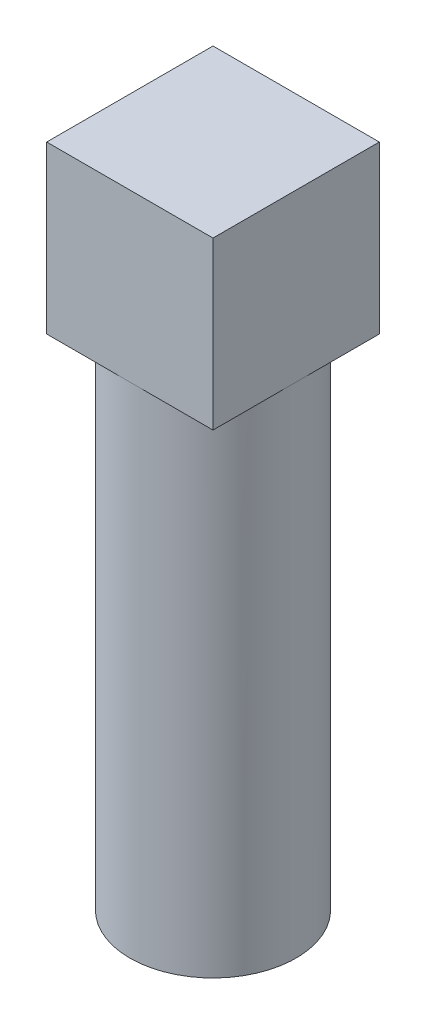
ISO-10303-21;
HEADER;
FILE_DESCRIPTION(('STEP AP214'),'2;1');
FILE_NAME('part.step','',(''),(''),'','','');
FILE_SCHEMA(('AUTOMOTIVE_DESIGN { 1 0 10303 214 1 1 1 1 }'));
ENDSEC;
DATA;
#1=APPLICATION_CONTEXT('core data for automotive mechanical design processes');
#2=APPLICATION_PROTOCOL_DEFINITION('international standard','automotive_design',2000,#1);
#3=PRODUCT_CONTEXT('',#1,'mechanical');
#4=PRODUCT('Part','Part','',(#3));
#5=PRODUCT_RELATED_PRODUCT_CATEGORY('part','',(#4));
#6=PRODUCT_DEFINITION_FORMATION('','',#4);
#7=PRODUCT_DEFINITION_CONTEXT('part definition',#1,'design');
#8=PRODUCT_DEFINITION('design','',#6,#7);
#9=PRODUCT_DEFINITION_SHAPE('','',#8);
#10=(LENGTH_UNIT() NAMED_UNIT(*) SI_UNIT(.MILLI.,.METRE.));
#11=(NAMED_UNIT(*) PLANE_ANGLE_UNIT() SI_UNIT($,.RADIAN.));
#12=(NAMED_UNIT(*) SI_UNIT($,.STERADIAN.) SOLID_ANGLE_UNIT());
#13=UNCERTAINTY_MEASURE_WITH_UNIT(LENGTH_MEASURE(1.E-05),#10,'distance_accuracy_value','');
#14=(GEOMETRIC_REPRESENTATION_CONTEXT(3) GLOBAL_UNCERTAINTY_ASSIGNED_CONTEXT((#13)) GLOBAL_UNIT_ASSIGNED_CONTEXT((#10,
#11,#12)) REPRESENTATION_CONTEXT('',''));
#15=CARTESIAN_POINT('',(0.,0.,0.));
#16=DIRECTION('',(0.,0.,1.));
#17=DIRECTION('',(1.,0.,0.));
#18=AXIS2_PLACEMENT_3D('',#15,#16,#17);
#19=CARTESIAN_POINT('',(0.,4.,0.));
#20=DIRECTION('',(0.,-1.,0.));
#21=DIRECTION('',(0.,0.,-1.));
#22=AXIS2_PLACEMENT_3D('',#19,#20,#21);
#23=CYLINDRICAL_SURFACE('',#22,0.5);
#24=CARTESIAN_POINT('',(0.,3.,0.));
#25=DIRECTION('',(0.,-1.,0.));
#26=DIRECTION('',(0.,0.,-1.));
#27=AXIS2_PLACEMENT_3D('',#24,#25,#26);
#28=CIRCLE('',#27,0.5);
#29=CARTESIAN_POINT('',(-0.5,3.,0.));
#30=VERTEX_POINT('',#29);
#31=CARTESIAN_POINT('',(0.,3.,-0.5));
#32=VERTEX_POINT('',#31);
#33=EDGE_CURVE('E38',#30,#32,#28,.T.);
#34=ORIENTED_EDGE('',*,*,#33,.T.);
#35=CARTESIAN_POINT('',(0.5,3.,0.));
#36=VERTEX_POINT('',#35);
#37=EDGE_CURVE('E11',#32,#36,#28,.T.);
#38=ORIENTED_EDGE('',*,*,#37,.T.);
#39=CARTESIAN_POINT('',(0.,3.,0.5));
#40=VERTEX_POINT('',#39);
#41=EDGE_CURVE('E43',#36,#40,#28,.T.);
#42=ORIENTED_EDGE('',*,*,#41,.T.);
#43=EDGE_CURVE('E113',#40,#30,#28,.T.);
#44=ORIENTED_EDGE('',*,*,#43,.T.);
#45=EDGE_LOOP('',(#34,#38,#42,#44));
#46=FACE_BOUND('',#45,.T.);
#47=CARTESIAN_POINT('',(0.,0.,0.));
#48=DIRECTION('',(0.,1.,0.));
#49=DIRECTION('',(0.,0.,1.));
#50=AXIS2_PLACEMENT_3D('',#47,#48,#49);
#51=CIRCLE('',#50,0.5);
#52=CARTESIAN_POINT('',(0.,0.,0.5));
#53=VERTEX_POINT('',#52);
#54=EDGE_CURVE('E133',#53,#53,#51,.T.);
#55=ORIENTED_EDGE('',*,*,#54,.T.);
#56=EDGE_LOOP('',(#55));
#57=FACE_BOUND('',#56,.T.);
#58=ADVANCED_FACE('F35',(#46,#57),#23,.T.);
#59=CARTESIAN_POINT('',(0.,0.,0.));
#60=DIRECTION('',(0.,1.,0.));
#61=DIRECTION('',(0.,0.,1.));
#62=AXIS2_PLACEMENT_3D('',#59,#60,#61);
#63=PLANE('',#62);
#64=ORIENTED_EDGE('',*,*,#54,.F.);
#65=EDGE_LOOP('',(#64));
#66=FACE_BOUND('',#65,.T.);
#67=ADVANCED_FACE('F165',(#66),#63,.F.);
#68=CARTESIAN_POINT('',(0.,3.,0.));
#69=DIRECTION('',(0.,-1.,0.));
#70=DIRECTION('',(0.,0.,-1.));
#71=AXIS2_PLACEMENT_3D('',#68,#69,#70);
#72=PLANE('',#71);
#73=ORIENTED_EDGE('',*,*,#37,.F.);
#74=DIRECTION('',(-1.,0.,0.));
#75=VECTOR('',#74,1.);
#76=CARTESIAN_POINT('',(0.5,3.,-0.5));
#77=LINE('',#76,#75);
#78=CARTESIAN_POINT('',(0.5,3.,-0.5));
#79=VERTEX_POINT('',#78);
#80=EDGE_CURVE('E50',#79,#32,#77,.T.);
#81=ORIENTED_EDGE('',*,*,#80,.F.);
#82=DIRECTION('',(0.,0.,-1.));
#83=VECTOR('',#82,1.);
#84=CARTESIAN_POINT('',(0.5,3.,-0.5));
#85=LINE('',#84,#83);
#86=EDGE_CURVE('E115',#36,#79,#85,.T.);
#87=ORIENTED_EDGE('',*,*,#86,.F.);
#88=EDGE_LOOP('',(#73,#81,#87));
#89=FACE_BOUND('',#88,.T.);
#90=ADVANCED_FACE('F147',(#89),#72,.T.);
#91=ORIENTED_EDGE('',*,*,#41,.F.);
#92=CARTESIAN_POINT('',(0.5,3.,0.5));
#93=VERTEX_POINT('',#92);
#94=EDGE_CURVE('E118',#93,#36,#85,.T.);
#95=ORIENTED_EDGE('',*,*,#94,.F.);
#96=DIRECTION('',(1.,0.,0.));
#97=VECTOR('',#96,1.);
#98=CARTESIAN_POINT('',(0.5,3.,0.5));
#99=LINE('',#98,#97);
#100=EDGE_CURVE('E116',#40,#93,#99,.T.);
#101=ORIENTED_EDGE('',*,*,#100,.F.);
#102=EDGE_LOOP('',(#91,#95,#101));
#103=FACE_BOUND('',#102,.T.);
#104=ADVANCED_FACE('F145',(#103),#72,.T.);
#105=ORIENTED_EDGE('',*,*,#43,.F.);
#106=CARTESIAN_POINT('',(-0.5,3.,0.5));
#107=VERTEX_POINT('',#106);
#108=EDGE_CURVE('E104',#107,#40,#99,.T.);
#109=ORIENTED_EDGE('',*,*,#108,.F.);
#110=DIRECTION('',(0.,0.,1.));
#111=VECTOR('',#110,1.);
#112=CARTESIAN_POINT('',(-0.5,3.,-0.5));
#113=LINE('',#112,#111);
#114=EDGE_CURVE('E89',#30,#107,#113,.T.);
#115=ORIENTED_EDGE('',*,*,#114,.F.);
#116=EDGE_LOOP('',(#105,#109,#115));
#117=FACE_BOUND('',#116,.T.);
#118=ADVANCED_FACE('F112',(#117),#72,.T.);
#119=ORIENTED_EDGE('',*,*,#33,.F.);
#120=CARTESIAN_POINT('',(-0.5,3.,-0.5));
#121=VERTEX_POINT('',#120);
#122=EDGE_CURVE('E95',#121,#30,#113,.T.);
#123=ORIENTED_EDGE('',*,*,#122,.F.);
#124=EDGE_CURVE('E122',#32,#121,#77,.T.);
#125=ORIENTED_EDGE('',*,*,#124,.F.);
#126=EDGE_LOOP('',(#119,#123,#125));
#127=FACE_BOUND('',#126,.T.);
#128=ADVANCED_FACE('F155',(#127),#72,.T.);
#129=CARTESIAN_POINT('',(-0.5,3.,-0.5));
#130=DIRECTION('',(-1.,0.,0.));
#131=DIRECTION('',(0.,0.,1.));
#132=AXIS2_PLACEMENT_3D('',#129,#130,#131);
#133=PLANE('',#132);
#134=ORIENTED_EDGE('',*,*,#122,.T.);
#135=ORIENTED_EDGE('',*,*,#114,.T.);
#136=DIRECTION('',(0.,1.,0.));
#137=VECTOR('',#136,1.);
#138=CARTESIAN_POINT('',(-0.5,3.,0.5));
#139=LINE('',#138,#137);
#140=CARTESIAN_POINT('',(-0.5,4.,0.5));
#141=VERTEX_POINT('',#140);
#142=EDGE_CURVE('E93',#107,#141,#139,.T.);
#143=ORIENTED_EDGE('',*,*,#142,.T.);
#144=DIRECTION('',(0.,0.,1.));
#145=VECTOR('',#144,1.);
#146=CARTESIAN_POINT('',(-0.5,4.,-0.5));
#147=LINE('',#146,#145);
#148=CARTESIAN_POINT('',(-0.5,4.,-0.5));
#149=VERTEX_POINT('',#148);
#150=EDGE_CURVE('E124',#149,#141,#147,.T.);
#151=ORIENTED_EDGE('',*,*,#150,.F.);
#152=DIRECTION('',(0.,1.,0.));
#153=VECTOR('',#152,1.);
#154=CARTESIAN_POINT('',(-0.5,3.,-0.5));
#155=LINE('',#154,#153);
#156=EDGE_CURVE('E130',#121,#149,#155,.T.);
#157=ORIENTED_EDGE('',*,*,#156,.F.);
#158=EDGE_LOOP('',(#134,#135,#143,#151,#157));
#159=FACE_BOUND('',#158,.T.);
#160=ADVANCED_FACE('F91',(#159),#133,.T.);
#161=CARTESIAN_POINT('',(0.5,3.,-0.5));
#162=DIRECTION('',(0.,0.,-1.));
#163=DIRECTION('',(-1.,0.,0.));
#164=AXIS2_PLACEMENT_3D('',#161,#162,#163);
#165=PLANE('',#164);
#166=ORIENTED_EDGE('',*,*,#80,.T.);
#167=ORIENTED_EDGE('',*,*,#124,.T.);
#168=ORIENTED_EDGE('',*,*,#156,.T.);
#169=DIRECTION('',(-1.,0.,0.));
#170=VECTOR('',#169,1.);
#171=CARTESIAN_POINT('',(0.5,4.,-0.5));
#172=LINE('',#171,#170);
#173=CARTESIAN_POINT('',(0.5,4.,-0.5));
#174=VERTEX_POINT('',#173);
#175=EDGE_CURVE('E99',#174,#149,#172,.T.);
#176=ORIENTED_EDGE('',*,*,#175,.F.);
#177=DIRECTION('',(0.,1.,0.));
#178=VECTOR('',#177,1.);
#179=CARTESIAN_POINT('',(0.5,3.,-0.5));
#180=LINE('',#179,#178);
#181=EDGE_CURVE('E134',#79,#174,#180,.T.);
#182=ORIENTED_EDGE('',*,*,#181,.F.);
#183=EDGE_LOOP('',(#166,#167,#168,#176,#182));
#184=FACE_BOUND('',#183,.T.);
#185=ADVANCED_FACE('F154',(#184),#165,.T.);
#186=CARTESIAN_POINT('',(0.5,3.,-0.5));
#187=DIRECTION('',(1.,0.,0.));
#188=DIRECTION('',(0.,0.,-1.));
#189=AXIS2_PLACEMENT_3D('',#186,#187,#188);
#190=PLANE('',#189);
#191=ORIENTED_EDGE('',*,*,#94,.T.);
#192=ORIENTED_EDGE('',*,*,#86,.T.);
#193=ORIENTED_EDGE('',*,*,#181,.T.);
#194=DIRECTION('',(0.,0.,-1.));
#195=VECTOR('',#194,1.);
#196=CARTESIAN_POINT('',(0.5,4.,-0.5));
#197=LINE('',#196,#195);
#198=CARTESIAN_POINT('',(0.5,4.,0.5));
#199=VERTEX_POINT('',#198);
#200=EDGE_CURVE('E127',#199,#174,#197,.T.);
#201=ORIENTED_EDGE('',*,*,#200,.F.);
#202=DIRECTION('',(0.,1.,0.));
#203=VECTOR('',#202,1.);
#204=CARTESIAN_POINT('',(0.5,3.,0.5));
#205=LINE('',#204,#203);
#206=EDGE_CURVE('E110',#93,#199,#205,.T.);
#207=ORIENTED_EDGE('',*,*,#206,.F.);
#208=EDGE_LOOP('',(#191,#192,#193,#201,#207));
#209=FACE_BOUND('',#208,.T.);
#210=ADVANCED_FACE('F150',(#209),#190,.T.);
#211=CARTESIAN_POINT('',(0.5,3.,0.5));
#212=DIRECTION('',(0.,0.,1.));
#213=DIRECTION('',(1.,0.,0.));
#214=AXIS2_PLACEMENT_3D('',#211,#212,#213);
#215=PLANE('',#214);
#216=ORIENTED_EDGE('',*,*,#108,.T.);
#217=ORIENTED_EDGE('',*,*,#100,.T.);
#218=ORIENTED_EDGE('',*,*,#206,.T.);
#219=DIRECTION('',(1.,0.,0.));
#220=VECTOR('',#219,1.);
#221=CARTESIAN_POINT('',(0.5,4.,0.5));
#222=LINE('',#221,#220);
#223=EDGE_CURVE('E108',#141,#199,#222,.T.);
#224=ORIENTED_EDGE('',*,*,#223,.F.);
#225=ORIENTED_EDGE('',*,*,#142,.F.);
#226=EDGE_LOOP('',(#216,#217,#218,#224,#225));
#227=FACE_BOUND('',#226,.T.);
#228=ADVANCED_FACE('F103',(#227),#215,.T.);
#229=CARTESIAN_POINT('',(0.,4.,0.));
#230=DIRECTION('',(0.,1.,0.));
#231=DIRECTION('',(0.,0.,1.));
#232=AXIS2_PLACEMENT_3D('',#229,#230,#231);
#233=PLANE('',#232);
#234=ORIENTED_EDGE('',*,*,#150,.T.);
#235=ORIENTED_EDGE('',*,*,#223,.T.);
#236=ORIENTED_EDGE('',*,*,#200,.T.);
#237=ORIENTED_EDGE('',*,*,#175,.T.);
#238=EDGE_LOOP('',(#234,#235,#236,#237));
#239=FACE_BOUND('',#238,.T.);
#240=ADVANCED_FACE('F153',(#239),#233,.T.);
#241=CLOSED_SHELL('',(#58,#67,#90,#104,#118,#128,#160,#185,#210,#228,#240));
#242=MANIFOLD_SOLID_BREP('B2',#241);
#243=ADVANCED_BREP_SHAPE_REPRESENTATION('',(#18,#242),#14);
#244=SHAPE_DEFINITION_REPRESENTATION(#9,#243);
ENDSEC;
END-ISO-10303-21;
